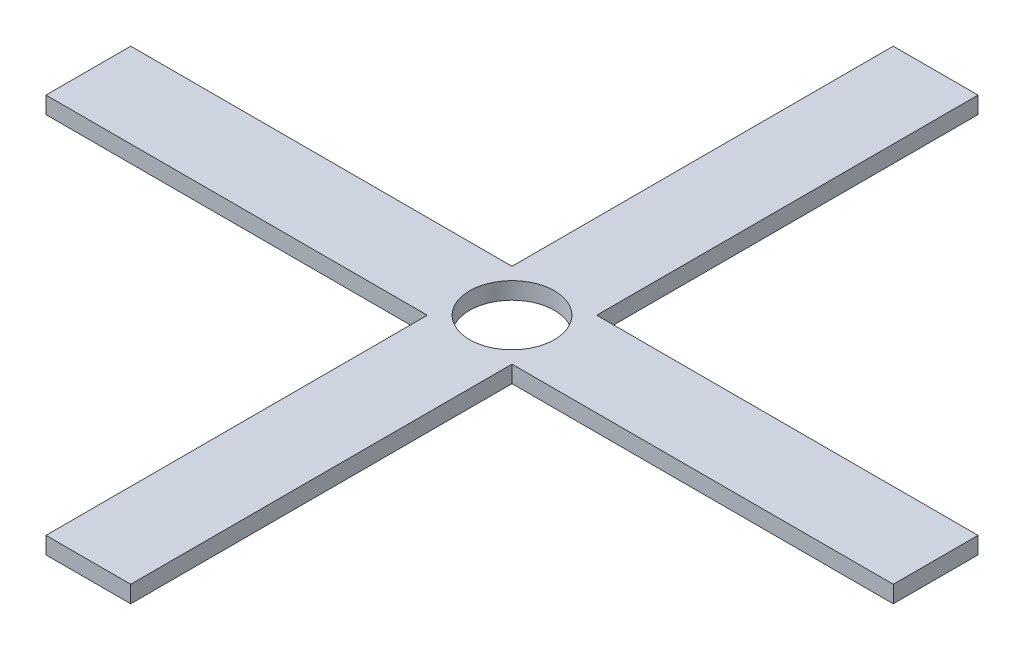
ISO-10303-21;
HEADER;
FILE_DESCRIPTION(('STEP AP214'),'2;1');
FILE_NAME('part.step','',(''),(''),'','','');
FILE_SCHEMA(('AUTOMOTIVE_DESIGN { 1 0 10303 214 1 1 1 1 }'));
ENDSEC;
DATA;
#1=APPLICATION_CONTEXT('core data for automotive mechanical design processes');
#2=APPLICATION_PROTOCOL_DEFINITION('international standard','automotive_design',2000,#1);
#3=PRODUCT_CONTEXT('',#1,'mechanical');
#4=PRODUCT('Part','Part','',(#3));
#5=PRODUCT_RELATED_PRODUCT_CATEGORY('part','',(#4));
#6=PRODUCT_DEFINITION_FORMATION('','',#4);
#7=PRODUCT_DEFINITION_CONTEXT('part definition',#1,'design');
#8=PRODUCT_DEFINITION('design','',#6,#7);
#9=PRODUCT_DEFINITION_SHAPE('','',#8);
#10=(LENGTH_UNIT() NAMED_UNIT(*) SI_UNIT(.MILLI.,.METRE.));
#11=(NAMED_UNIT(*) PLANE_ANGLE_UNIT() SI_UNIT($,.RADIAN.));
#12=(NAMED_UNIT(*) SI_UNIT($,.STERADIAN.) SOLID_ANGLE_UNIT());
#13=UNCERTAINTY_MEASURE_WITH_UNIT(LENGTH_MEASURE(1.E-05),#10,'distance_accuracy_value','');
#14=(GEOMETRIC_REPRESENTATION_CONTEXT(3) GLOBAL_UNCERTAINTY_ASSIGNED_CONTEXT((#13)) GLOBAL_UNIT_ASSIGNED_CONTEXT((#10,
#11,#12)) REPRESENTATION_CONTEXT('',''));
#15=CARTESIAN_POINT('',(0.,0.,0.));
#16=DIRECTION('',(0.,0.,1.));
#17=DIRECTION('',(1.,0.,0.));
#18=AXIS2_PLACEMENT_3D('',#15,#16,#17);
#19=CARTESIAN_POINT('',(-2.5,0.1,-0.25));
#20=DIRECTION('',(0.,0.,1.));
#21=DIRECTION('',(1.,0.,0.));
#22=AXIS2_PLACEMENT_3D('',#19,#20,#21);
#23=PLANE('',#22);
#24=DIRECTION('',(0.,-1.,0.));
#25=VECTOR('',#24,1.);
#26=CARTESIAN_POINT('',(0.25,0.1,-0.25));
#27=LINE('',#26,#25);
#28=CARTESIAN_POINT('',(0.25,0.1,-0.25));
#29=VERTEX_POINT('',#28);
#30=CARTESIAN_POINT('',(0.25,0.,-0.25));
#31=VERTEX_POINT('',#30);
#32=EDGE_CURVE('E176',#29,#31,#27,.T.);
#33=ORIENTED_EDGE('',*,*,#32,.F.);
#34=DIRECTION('',(-1.,0.,0.));
#35=VECTOR('',#34,1.);
#36=CARTESIAN_POINT('',(-2.5,0.1,-0.25));
#37=LINE('',#36,#35);
#38=CARTESIAN_POINT('',(2.5,0.1,-0.25));
#39=VERTEX_POINT('',#38);
#40=EDGE_CURVE('E138',#39,#29,#37,.T.);
#41=ORIENTED_EDGE('',*,*,#40,.F.);
#42=DIRECTION('',(0.,-1.,0.));
#43=VECTOR('',#42,1.);
#44=CARTESIAN_POINT('',(2.5,0.1,-0.25));
#45=LINE('',#44,#43);
#46=CARTESIAN_POINT('',(2.5,0.,-0.25));
#47=VERTEX_POINT('',#46);
#48=EDGE_CURVE('E11',#39,#47,#45,.T.);
#49=ORIENTED_EDGE('',*,*,#48,.T.);
#50=DIRECTION('',(-1.,0.,0.));
#51=VECTOR('',#50,1.);
#52=CARTESIAN_POINT('',(-2.5,0.,-0.25));
#53=LINE('',#52,#51);
#54=EDGE_CURVE('E198',#47,#31,#53,.T.);
#55=ORIENTED_EDGE('',*,*,#54,.T.);
#56=EDGE_LOOP('',(#33,#41,#49,#55));
#57=FACE_BOUND('',#56,.T.);
#58=ADVANCED_FACE('F39',(#57),#23,.F.);
#59=DIRECTION('',(0.,1.,0.));
#60=VECTOR('',#59,1.);
#61=CARTESIAN_POINT('',(-0.25,0.1,-0.25));
#62=LINE('',#61,#60);
#63=CARTESIAN_POINT('',(-0.25,0.,-0.25));
#64=VERTEX_POINT('',#63);
#65=CARTESIAN_POINT('',(-0.25,0.1,-0.25));
#66=VERTEX_POINT('',#65);
#67=EDGE_CURVE('E164',#64,#66,#62,.T.);
#68=ORIENTED_EDGE('',*,*,#67,.F.);
#69=CARTESIAN_POINT('',(-2.5,0.,-0.25));
#70=VERTEX_POINT('',#69);
#71=EDGE_CURVE('E197',#64,#70,#53,.T.);
#72=ORIENTED_EDGE('',*,*,#71,.T.);
#73=DIRECTION('',(0.,-1.,0.));
#74=VECTOR('',#73,1.);
#75=CARTESIAN_POINT('',(-2.5,0.1,-0.25));
#76=LINE('',#75,#74);
#77=CARTESIAN_POINT('',(-2.5,0.1,-0.25));
#78=VERTEX_POINT('',#77);
#79=EDGE_CURVE('E48',#78,#70,#76,.T.);
#80=ORIENTED_EDGE('',*,*,#79,.F.);
#81=EDGE_CURVE('E183',#66,#78,#37,.T.);
#82=ORIENTED_EDGE('',*,*,#81,.F.);
#83=EDGE_LOOP('',(#68,#72,#80,#82));
#84=FACE_BOUND('',#83,.T.);
#85=ADVANCED_FACE('F299',(#84),#23,.F.);
#86=CARTESIAN_POINT('',(-2.5,0.1,0.25));
#87=DIRECTION('',(0.,0.,-1.));
#88=DIRECTION('',(-1.,0.,0.));
#89=AXIS2_PLACEMENT_3D('',#86,#87,#88);
#90=PLANE('',#89);
#91=DIRECTION('',(0.,1.,0.));
#92=VECTOR('',#91,1.);
#93=CARTESIAN_POINT('',(0.25,0.1,0.25));
#94=LINE('',#93,#92);
#95=CARTESIAN_POINT('',(0.25,0.,0.25));
#96=VERTEX_POINT('',#95);
#97=CARTESIAN_POINT('',(0.25,0.1,0.25));
#98=VERTEX_POINT('',#97);
#99=EDGE_CURVE('E173',#96,#98,#94,.T.);
#100=ORIENTED_EDGE('',*,*,#99,.F.);
#101=DIRECTION('',(1.,0.,0.));
#102=VECTOR('',#101,1.);
#103=CARTESIAN_POINT('',(-2.5,0.,0.25));
#104=LINE('',#103,#102);
#105=CARTESIAN_POINT('',(2.5,0.,0.25));
#106=VERTEX_POINT('',#105);
#107=EDGE_CURVE('E204',#96,#106,#104,.T.);
#108=ORIENTED_EDGE('',*,*,#107,.T.);
#109=DIRECTION('',(0.,-1.,0.));
#110=VECTOR('',#109,1.);
#111=CARTESIAN_POINT('',(2.5,0.1,0.25));
#112=LINE('',#111,#110);
#113=CARTESIAN_POINT('',(2.5,0.1,0.25));
#114=VERTEX_POINT('',#113);
#115=EDGE_CURVE('E193',#114,#106,#112,.T.);
#116=ORIENTED_EDGE('',*,*,#115,.F.);
#117=DIRECTION('',(1.,0.,0.));
#118=VECTOR('',#117,1.);
#119=CARTESIAN_POINT('',(-2.5,0.1,0.25));
#120=LINE('',#119,#118);
#121=EDGE_CURVE('E55',#98,#114,#120,.T.);
#122=ORIENTED_EDGE('',*,*,#121,.F.);
#123=EDGE_LOOP('',(#100,#108,#116,#122));
#124=FACE_BOUND('',#123,.T.);
#125=ADVANCED_FACE('F304',(#124),#90,.F.);
#126=DIRECTION('',(0.,-1.,0.));
#127=VECTOR('',#126,1.);
#128=CARTESIAN_POINT('',(-0.25,0.1,0.25));
#129=LINE('',#128,#127);
#130=CARTESIAN_POINT('',(-0.25,0.1,0.25));
#131=VERTEX_POINT('',#130);
#132=CARTESIAN_POINT('',(-0.25,0.,0.25));
#133=VERTEX_POINT('',#132);
#134=EDGE_CURVE('E63',#131,#133,#129,.T.);
#135=ORIENTED_EDGE('',*,*,#134,.F.);
#136=CARTESIAN_POINT('',(-2.5,0.1,0.25));
#137=VERTEX_POINT('',#136);
#138=EDGE_CURVE('E190',#137,#131,#120,.T.);
#139=ORIENTED_EDGE('',*,*,#138,.F.);
#140=DIRECTION('',(0.,-1.,0.));
#141=VECTOR('',#140,1.);
#142=CARTESIAN_POINT('',(-2.5,0.1,0.25));
#143=LINE('',#142,#141);
#144=CARTESIAN_POINT('',(-2.5,0.,0.25));
#145=VERTEX_POINT('',#144);
#146=EDGE_CURVE('E210',#137,#145,#143,.T.);
#147=ORIENTED_EDGE('',*,*,#146,.T.);
#148=EDGE_CURVE('E184',#145,#133,#104,.T.);
#149=ORIENTED_EDGE('',*,*,#148,.T.);
#150=EDGE_LOOP('',(#135,#139,#147,#149));
#151=FACE_BOUND('',#150,.T.);
#152=ADVANCED_FACE('F230',(#151),#90,.F.);
#153=CARTESIAN_POINT('',(2.5,0.1,0.25));
#154=DIRECTION('',(-1.,0.,0.));
#155=DIRECTION('',(0.,0.,1.));
#156=AXIS2_PLACEMENT_3D('',#153,#154,#155);
#157=PLANE('',#156);
#158=DIRECTION('',(0.,0.,-1.));
#159=VECTOR('',#158,1.);
#160=CARTESIAN_POINT('',(2.5,0.,0.25));
#161=LINE('',#160,#159);
#162=EDGE_CURVE('E179',#106,#47,#161,.T.);
#163=ORIENTED_EDGE('',*,*,#162,.T.);
#164=ORIENTED_EDGE('',*,*,#48,.F.);
#165=DIRECTION('',(0.,0.,-1.));
#166=VECTOR('',#165,1.);
#167=CARTESIAN_POINT('',(2.5,0.1,0.25));
#168=LINE('',#167,#166);
#169=EDGE_CURVE('E180',#114,#39,#168,.T.);
#170=ORIENTED_EDGE('',*,*,#169,.F.);
#171=ORIENTED_EDGE('',*,*,#115,.T.);
#172=EDGE_LOOP('',(#163,#164,#170,#171));
#173=FACE_BOUND('',#172,.T.);
#174=ADVANCED_FACE('F41',(#173),#157,.F.);
#175=CARTESIAN_POINT('',(-2.5,0.1,0.25));
#176=DIRECTION('',(1.,0.,0.));
#177=DIRECTION('',(0.,0.,-1.));
#178=AXIS2_PLACEMENT_3D('',#175,#176,#177);
#179=PLANE('',#178);
#180=DIRECTION('',(0.,0.,1.));
#181=VECTOR('',#180,1.);
#182=CARTESIAN_POINT('',(-2.5,0.,0.25));
#183=LINE('',#182,#181);
#184=EDGE_CURVE('E201',#70,#145,#183,.T.);
#185=ORIENTED_EDGE('',*,*,#184,.T.);
#186=ORIENTED_EDGE('',*,*,#146,.F.);
#187=DIRECTION('',(0.,0.,1.));
#188=VECTOR('',#187,1.);
#189=CARTESIAN_POINT('',(-2.5,0.1,0.25));
#190=LINE('',#189,#188);
#191=EDGE_CURVE('E187',#78,#137,#190,.T.);
#192=ORIENTED_EDGE('',*,*,#191,.F.);
#193=ORIENTED_EDGE('',*,*,#79,.T.);
#194=EDGE_LOOP('',(#185,#186,#192,#193));
#195=FACE_BOUND('',#194,.T.);
#196=ADVANCED_FACE('F219',(#195),#179,.F.);
#197=CARTESIAN_POINT('',(0.,0.1,0.));
#198=DIRECTION('',(0.,-1.,0.));
#199=DIRECTION('',(0.,0.,-1.));
#200=AXIS2_PLACEMENT_3D('',#197,#198,#199);
#201=PLANE('',#200);
#202=CARTESIAN_POINT('',(0.,0.1,0.));
#203=DIRECTION('',(0.,-1.,0.));
#204=DIRECTION('',(0.,0.,-1.));
#205=AXIS2_PLACEMENT_3D('',#202,#203,#204);
#206=CIRCLE('',#205,0.25);
#207=CARTESIAN_POINT('',(0.,0.1,-0.25));
#208=VERTEX_POINT('',#207);
#209=EDGE_CURVE('E273',#208,#208,#206,.T.);
#210=ORIENTED_EDGE('',*,*,#209,.T.);
#211=EDGE_LOOP('',(#210));
#212=FACE_BOUND('',#211,.T.);
#213=ORIENTED_EDGE('',*,*,#138,.T.);
#214=DIRECTION('',(0.,0.,1.));
#215=VECTOR('',#214,1.);
#216=CARTESIAN_POINT('',(-0.25,0.1,2.5));
#217=LINE('',#216,#215);
#218=CARTESIAN_POINT('',(-0.25,0.1,2.5));
#219=VERTEX_POINT('',#218);
#220=EDGE_CURVE('E154',#131,#219,#217,.T.);
#221=ORIENTED_EDGE('',*,*,#220,.T.);
#222=DIRECTION('',(1.,0.,0.));
#223=VECTOR('',#222,1.);
#224=CARTESIAN_POINT('',(-0.25,0.1,2.5));
#225=LINE('',#224,#223);
#226=CARTESIAN_POINT('',(0.25,0.1,2.5));
#227=VERTEX_POINT('',#226);
#228=EDGE_CURVE('E241',#219,#227,#225,.T.);
#229=ORIENTED_EDGE('',*,*,#228,.T.);
#230=DIRECTION('',(0.,0.,-1.));
#231=VECTOR('',#230,1.);
#232=CARTESIAN_POINT('',(0.25,0.1,2.5));
#233=LINE('',#232,#231);
#234=EDGE_CURVE('E143',#227,#98,#233,.T.);
#235=ORIENTED_EDGE('',*,*,#234,.T.);
#236=ORIENTED_EDGE('',*,*,#121,.T.);
#237=ORIENTED_EDGE('',*,*,#169,.T.);
#238=ORIENTED_EDGE('',*,*,#40,.T.);
#239=CARTESIAN_POINT('',(0.25,0.1,-2.5));
#240=VERTEX_POINT('',#239);
#241=EDGE_CURVE('E131',#29,#240,#233,.T.);
#242=ORIENTED_EDGE('',*,*,#241,.T.);
#243=DIRECTION('',(-1.,0.,0.));
#244=VECTOR('',#243,1.);
#245=CARTESIAN_POINT('',(-0.25,0.1,-2.5));
#246=LINE('',#245,#244);
#247=CARTESIAN_POINT('',(-0.25,0.1,-2.5));
#248=VERTEX_POINT('',#247);
#249=EDGE_CURVE('E135',#240,#248,#246,.T.);
#250=ORIENTED_EDGE('',*,*,#249,.T.);
#251=EDGE_CURVE('E238',#248,#66,#217,.T.);
#252=ORIENTED_EDGE('',*,*,#251,.T.);
#253=ORIENTED_EDGE('',*,*,#81,.T.);
#254=ORIENTED_EDGE('',*,*,#191,.T.);
#255=EDGE_LOOP('',(#213,#221,#229,#235,#236,#237,#238,#242,#250,#252,#253,#254));
#256=FACE_BOUND('',#255,.T.);
#257=ADVANCED_FACE('F133',(#212,#256),#201,.F.);
#258=CARTESIAN_POINT('',(0.,0.,0.));
#259=DIRECTION('',(0.,-1.,0.));
#260=DIRECTION('',(0.,0.,-1.));
#261=AXIS2_PLACEMENT_3D('',#258,#259,#260);
#262=PLANE('',#261);
#263=CARTESIAN_POINT('',(0.,0.,0.));
#264=DIRECTION('',(0.,1.,0.));
#265=DIRECTION('',(0.,0.,1.));
#266=AXIS2_PLACEMENT_3D('',#263,#264,#265);
#267=CIRCLE('',#266,0.25);
#268=CARTESIAN_POINT('',(0.,0.,0.25));
#269=VERTEX_POINT('',#268);
#270=EDGE_CURVE('E277',#269,#269,#267,.T.);
#271=ORIENTED_EDGE('',*,*,#270,.T.);
#272=EDGE_LOOP('',(#271));
#273=FACE_BOUND('',#272,.T.);
#274=ORIENTED_EDGE('',*,*,#71,.F.);
#275=DIRECTION('',(0.,0.,1.));
#276=VECTOR('',#275,1.);
#277=CARTESIAN_POINT('',(-0.25,0.,2.5));
#278=LINE('',#277,#276);
#279=CARTESIAN_POINT('',(-0.25,0.,-2.5));
#280=VERTEX_POINT('',#279);
#281=EDGE_CURVE('E253',#280,#64,#278,.T.);
#282=ORIENTED_EDGE('',*,*,#281,.F.);
#283=DIRECTION('',(-1.,0.,0.));
#284=VECTOR('',#283,1.);
#285=CARTESIAN_POINT('',(-0.25,0.,-2.5));
#286=LINE('',#285,#284);
#287=CARTESIAN_POINT('',(0.25,0.,-2.5));
#288=VERTEX_POINT('',#287);
#289=EDGE_CURVE('E250',#288,#280,#286,.T.);
#290=ORIENTED_EDGE('',*,*,#289,.F.);
#291=DIRECTION('',(0.,0.,-1.));
#292=VECTOR('',#291,1.);
#293=CARTESIAN_POINT('',(0.25,0.,2.5));
#294=LINE('',#293,#292);
#295=EDGE_CURVE('E158',#31,#288,#294,.T.);
#296=ORIENTED_EDGE('',*,*,#295,.F.);
#297=ORIENTED_EDGE('',*,*,#54,.F.);
#298=ORIENTED_EDGE('',*,*,#162,.F.);
#299=ORIENTED_EDGE('',*,*,#107,.F.);
#300=CARTESIAN_POINT('',(0.25,0.,2.5));
#301=VERTEX_POINT('',#300);
#302=EDGE_CURVE('E246',#301,#96,#294,.T.);
#303=ORIENTED_EDGE('',*,*,#302,.F.);
#304=DIRECTION('',(1.,0.,0.));
#305=VECTOR('',#304,1.);
#306=CARTESIAN_POINT('',(-0.25,0.,2.5));
#307=LINE('',#306,#305);
#308=CARTESIAN_POINT('',(-0.25,0.,2.5));
#309=VERTEX_POINT('',#308);
#310=EDGE_CURVE('E144',#309,#301,#307,.T.);
#311=ORIENTED_EDGE('',*,*,#310,.F.);
#312=EDGE_CURVE('E229',#133,#309,#278,.T.);
#313=ORIENTED_EDGE('',*,*,#312,.F.);
#314=ORIENTED_EDGE('',*,*,#148,.F.);
#315=ORIENTED_EDGE('',*,*,#184,.F.);
#316=EDGE_LOOP('',(#274,#282,#290,#296,#297,#298,#299,#303,#311,#313,#314,#315));
#317=FACE_BOUND('',#316,.T.);
#318=ADVANCED_FACE('F224',(#273,#317),#262,.T.);
#319=CARTESIAN_POINT('',(-0.25,0.1,2.5));
#320=DIRECTION('',(0.,0.,-1.));
#321=DIRECTION('',(-1.,0.,0.));
#322=AXIS2_PLACEMENT_3D('',#319,#320,#321);
#323=PLANE('',#322);
#324=ORIENTED_EDGE('',*,*,#310,.T.);
#325=DIRECTION('',(0.,-1.,0.));
#326=VECTOR('',#325,1.);
#327=CARTESIAN_POINT('',(0.25,0.1,2.5));
#328=LINE('',#327,#326);
#329=EDGE_CURVE('E245',#227,#301,#328,.T.);
#330=ORIENTED_EDGE('',*,*,#329,.F.);
#331=ORIENTED_EDGE('',*,*,#228,.F.);
#332=DIRECTION('',(0.,-1.,0.));
#333=VECTOR('',#332,1.);
#334=CARTESIAN_POINT('',(-0.25,0.1,2.5));
#335=LINE('',#334,#333);
#336=EDGE_CURVE('E166',#219,#309,#335,.T.);
#337=ORIENTED_EDGE('',*,*,#336,.T.);
#338=EDGE_LOOP('',(#324,#330,#331,#337));
#339=FACE_BOUND('',#338,.T.);
#340=ADVANCED_FACE('F263',(#339),#323,.F.);
#341=CARTESIAN_POINT('',(-0.25,0.1,2.5));
#342=DIRECTION('',(1.,0.,0.));
#343=DIRECTION('',(0.,0.,-1.));
#344=AXIS2_PLACEMENT_3D('',#341,#342,#343);
#345=PLANE('',#344);
#346=ORIENTED_EDGE('',*,*,#220,.F.);
#347=ORIENTED_EDGE('',*,*,#134,.T.);
#348=ORIENTED_EDGE('',*,*,#312,.T.);
#349=ORIENTED_EDGE('',*,*,#336,.F.);
#350=EDGE_LOOP('',(#346,#347,#348,#349));
#351=FACE_BOUND('',#350,.T.);
#352=ADVANCED_FACE('F233',(#351),#345,.F.);
#353=CARTESIAN_POINT('',(0.25,0.1,2.5));
#354=DIRECTION('',(-1.,0.,0.));
#355=DIRECTION('',(0.,0.,1.));
#356=AXIS2_PLACEMENT_3D('',#353,#354,#355);
#357=PLANE('',#356);
#358=ORIENTED_EDGE('',*,*,#302,.T.);
#359=ORIENTED_EDGE('',*,*,#99,.T.);
#360=ORIENTED_EDGE('',*,*,#234,.F.);
#361=ORIENTED_EDGE('',*,*,#329,.T.);
#362=EDGE_LOOP('',(#358,#359,#360,#361));
#363=FACE_BOUND('',#362,.T.);
#364=ADVANCED_FACE('F268',(#363),#357,.F.);
#365=ORIENTED_EDGE('',*,*,#241,.F.);
#366=ORIENTED_EDGE('',*,*,#32,.T.);
#367=ORIENTED_EDGE('',*,*,#295,.T.);
#368=DIRECTION('',(0.,-1.,0.));
#369=VECTOR('',#368,1.);
#370=CARTESIAN_POINT('',(0.25,0.1,-2.5));
#371=LINE('',#370,#369);
#372=EDGE_CURVE('E149',#240,#288,#371,.T.);
#373=ORIENTED_EDGE('',*,*,#372,.F.);
#374=EDGE_LOOP('',(#365,#366,#367,#373));
#375=FACE_BOUND('',#374,.T.);
#376=ADVANCED_FACE('F156',(#375),#357,.F.);
#377=ORIENTED_EDGE('',*,*,#281,.T.);
#378=ORIENTED_EDGE('',*,*,#67,.T.);
#379=ORIENTED_EDGE('',*,*,#251,.F.);
#380=DIRECTION('',(0.,-1.,0.));
#381=VECTOR('',#380,1.);
#382=CARTESIAN_POINT('',(-0.25,0.1,-2.5));
#383=LINE('',#382,#381);
#384=EDGE_CURVE('E151',#248,#280,#383,.T.);
#385=ORIENTED_EDGE('',*,*,#384,.T.);
#386=EDGE_LOOP('',(#377,#378,#379,#385));
#387=FACE_BOUND('',#386,.T.);
#388=ADVANCED_FACE('F318',(#387),#345,.F.);
#389=CARTESIAN_POINT('',(-0.25,0.1,-2.5));
#390=DIRECTION('',(0.,0.,1.));
#391=DIRECTION('',(1.,0.,0.));
#392=AXIS2_PLACEMENT_3D('',#389,#390,#391);
#393=PLANE('',#392);
#394=ORIENTED_EDGE('',*,*,#289,.T.);
#395=ORIENTED_EDGE('',*,*,#384,.F.);
#396=ORIENTED_EDGE('',*,*,#249,.F.);
#397=ORIENTED_EDGE('',*,*,#372,.T.);
#398=EDGE_LOOP('',(#394,#395,#396,#397));
#399=FACE_BOUND('',#398,.T.);
#400=ADVANCED_FACE('F148',(#399),#393,.F.);
#401=CARTESIAN_POINT('',(0.,0.,0.));
#402=DIRECTION('',(0.,1.,0.));
#403=DIRECTION('',(0.,0.,1.));
#404=AXIS2_PLACEMENT_3D('',#401,#402,#403);
#405=CYLINDRICAL_SURFACE('',#404,0.25);
#406=ORIENTED_EDGE('',*,*,#270,.F.);
#407=EDGE_LOOP('',(#406));
#408=FACE_BOUND('',#407,.T.);
#409=ORIENTED_EDGE('',*,*,#209,.F.);
#410=EDGE_LOOP('',(#409));
#411=FACE_BOUND('',#410,.T.);
#412=ADVANCED_FACE('F283',(#408,#411),#405,.F.);
#413=CLOSED_SHELL('',(#58,#85,#125,#152,#174,#196,#257,#318,#340,#352,#364,#376,#388,#400,#412));
#414=MANIFOLD_SOLID_BREP('B2',#413);
#415=ADVANCED_BREP_SHAPE_REPRESENTATION('',(#18,#414),#14);
#416=SHAPE_DEFINITION_REPRESENTATION(#9,#415);
ENDSEC;
END-ISO-10303-21;
